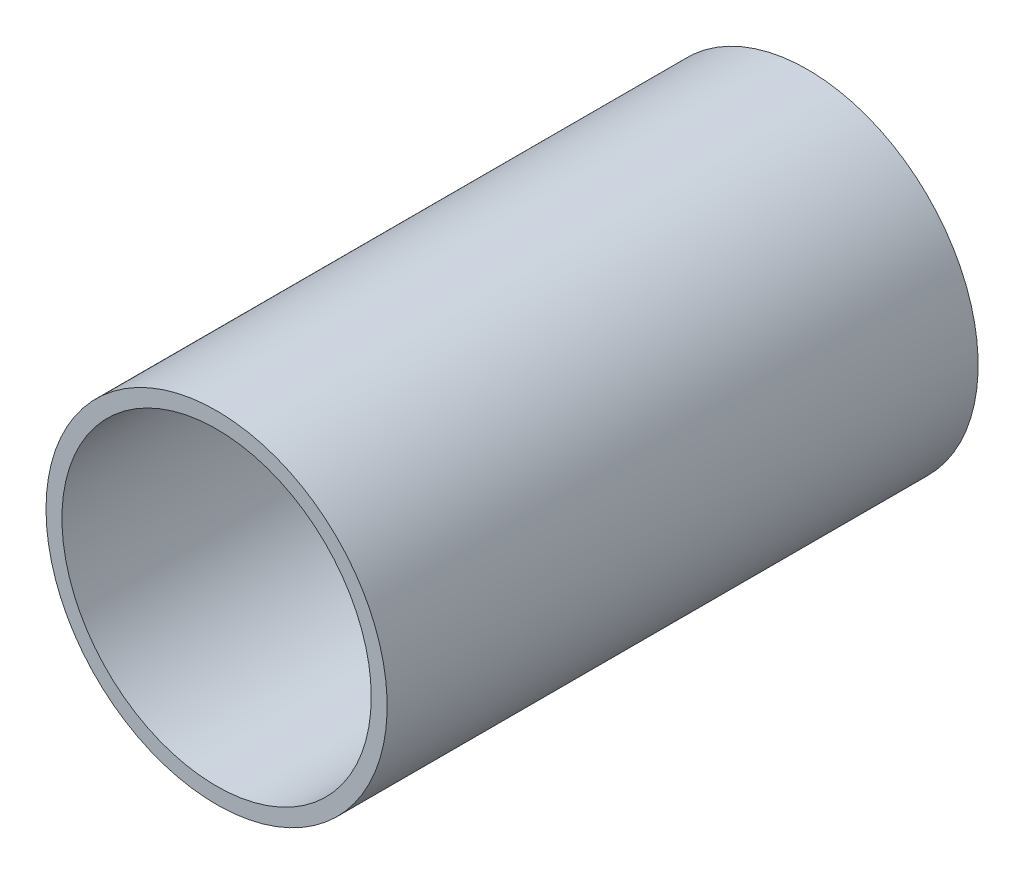
ISO-10303-21;
HEADER;
FILE_DESCRIPTION(('STEP AP214'),'2;1');
FILE_NAME('part.step','',(''),(''),'','','');
FILE_SCHEMA(('AUTOMOTIVE_DESIGN { 1 0 10303 214 1 1 1 1 }'));
ENDSEC;
DATA;
#1=APPLICATION_CONTEXT('core data for automotive mechanical design processes');
#2=APPLICATION_PROTOCOL_DEFINITION('international standard','automotive_design',2000,#1);
#3=PRODUCT_CONTEXT('',#1,'mechanical');
#4=PRODUCT('Part','Part','',(#3));
#5=PRODUCT_RELATED_PRODUCT_CATEGORY('part','',(#4));
#6=PRODUCT_DEFINITION_FORMATION('','',#4);
#7=PRODUCT_DEFINITION_CONTEXT('part definition',#1,'design');
#8=PRODUCT_DEFINITION('design','',#6,#7);
#9=PRODUCT_DEFINITION_SHAPE('','',#8);
#10=(LENGTH_UNIT() NAMED_UNIT(*) SI_UNIT(.MILLI.,.METRE.));
#11=(NAMED_UNIT(*) PLANE_ANGLE_UNIT() SI_UNIT($,.RADIAN.));
#12=(NAMED_UNIT(*) SI_UNIT($,.STERADIAN.) SOLID_ANGLE_UNIT());
#13=UNCERTAINTY_MEASURE_WITH_UNIT(LENGTH_MEASURE(1.E-05),#10,'distance_accuracy_value','');
#14=(GEOMETRIC_REPRESENTATION_CONTEXT(3) GLOBAL_UNCERTAINTY_ASSIGNED_CONTEXT((#13)) GLOBAL_UNIT_ASSIGNED_CONTEXT((#10,
#11,#12)) REPRESENTATION_CONTEXT('',''));
#15=CARTESIAN_POINT('',(0.,0.,0.));
#16=DIRECTION('',(0.,0.,1.));
#17=DIRECTION('',(1.,0.,0.));
#18=AXIS2_PLACEMENT_3D('',#15,#16,#17);
#19=CARTESIAN_POINT('',(9.906,115.094,60.35));
#20=DIRECTION('',(0.,0.,-1.));
#21=DIRECTION('',(-1.,0.,0.));
#22=AXIS2_PLACEMENT_3D('',#19,#20,#21);
#23=PLANE('',#22);
#24=CARTESIAN_POINT('',(0.,125.,60.35));
#25=DIRECTION('',(0.,0.,1.));
#26=DIRECTION('',(1.,0.,0.));
#27=AXIS2_PLACEMENT_3D('',#24,#25,#26);
#28=CIRCLE('',#27,8.636);
#29=CARTESIAN_POINT('',(8.636,125.,60.35));
#30=VERTEX_POINT('',#29);
#31=EDGE_CURVE('E27',#30,#30,#28,.F.);
#32=ORIENTED_EDGE('',*,*,#31,.F.);
#33=EDGE_LOOP('',(#32));
#34=FACE_BOUND('',#33,.T.);
#35=CARTESIAN_POINT('',(0.,125.,60.3500000000011));
#36=DIRECTION('',(0.,0.,-1.));
#37=DIRECTION('',(-1.,0.,0.));
#38=AXIS2_PLACEMENT_3D('',#35,#36,#37);
#39=CIRCLE('',#38,9.525);
#40=CARTESIAN_POINT('',(-9.525,125.,60.3500000000011));
#41=VERTEX_POINT('',#40);
#42=EDGE_CURVE('E18',#41,#41,#39,.T.);
#43=ORIENTED_EDGE('',*,*,#42,.T.);
#44=EDGE_LOOP('',(#43));
#45=FACE_BOUND('',#44,.T.);
#46=ADVANCED_FACE('F14',(#34,#45),#23,.T.);
#47=CARTESIAN_POINT('',(0.,125.,93.35));
#48=DIRECTION('',(0.,0.,-1.));
#49=DIRECTION('',(-1.,0.,0.));
#50=AXIS2_PLACEMENT_3D('',#47,#48,#49);
#51=CYLINDRICAL_SURFACE('',#50,9.525);
#52=ORIENTED_EDGE('',*,*,#42,.F.);
#53=EDGE_LOOP('',(#52));
#54=FACE_BOUND('',#53,.T.);
#55=CARTESIAN_POINT('',(0.,125.,93.35));
#56=DIRECTION('',(0.,0.,-1.));
#57=DIRECTION('',(-1.,0.,0.));
#58=AXIS2_PLACEMENT_3D('',#55,#56,#57);
#59=CIRCLE('',#58,9.525);
#60=CARTESIAN_POINT('',(-9.525,125.,93.35));
#61=VERTEX_POINT('',#60);
#62=EDGE_CURVE('E22',#61,#61,#59,.T.);
#63=ORIENTED_EDGE('',*,*,#62,.T.);
#64=EDGE_LOOP('',(#63));
#65=FACE_BOUND('',#64,.T.);
#66=ADVANCED_FACE('F36',(#54,#65),#51,.T.);
#67=CARTESIAN_POINT('',(0.,125.,60.35));
#68=DIRECTION('',(0.,0.,1.));
#69=DIRECTION('',(1.,0.,0.));
#70=AXIS2_PLACEMENT_3D('',#67,#68,#69);
#71=CYLINDRICAL_SURFACE('',#70,8.636);
#72=ORIENTED_EDGE('',*,*,#31,.T.);
#73=EDGE_LOOP('',(#72));
#74=FACE_BOUND('',#73,.T.);
#75=CARTESIAN_POINT('',(0.,125.,93.3499999999989));
#76=DIRECTION('',(0.,0.,1.));
#77=DIRECTION('',(1.,0.,0.));
#78=AXIS2_PLACEMENT_3D('',#75,#76,#77);
#79=CIRCLE('',#78,8.636);
#80=CARTESIAN_POINT('',(8.636,125.,93.3499999999989));
#81=VERTEX_POINT('',#80);
#82=EDGE_CURVE('E10',#81,#81,#79,.T.);
#83=ORIENTED_EDGE('',*,*,#82,.T.);
#84=EDGE_LOOP('',(#83));
#85=FACE_BOUND('',#84,.T.);
#86=ADVANCED_FACE('F39',(#74,#85),#71,.F.);
#87=CARTESIAN_POINT('',(9.906,115.094,93.35));
#88=DIRECTION('',(0.,0.,-1.));
#89=DIRECTION('',(-1.,0.,0.));
#90=AXIS2_PLACEMENT_3D('',#87,#88,#89);
#91=PLANE('',#90);
#92=ORIENTED_EDGE('',*,*,#82,.F.);
#93=EDGE_LOOP('',(#92));
#94=FACE_BOUND('',#93,.T.);
#95=ORIENTED_EDGE('',*,*,#62,.F.);
#96=EDGE_LOOP('',(#95));
#97=FACE_BOUND('',#96,.T.);
#98=ADVANCED_FACE('F16',(#94,#97),#91,.F.);
#99=CLOSED_SHELL('',(#46,#66,#86,#98));
#100=MANIFOLD_SOLID_BREP('B1',#99);
#101=ADVANCED_BREP_SHAPE_REPRESENTATION('',(#18,#100),#14);
#102=SHAPE_DEFINITION_REPRESENTATION(#9,#101);
ENDSEC;
END-ISO-10303-21;
